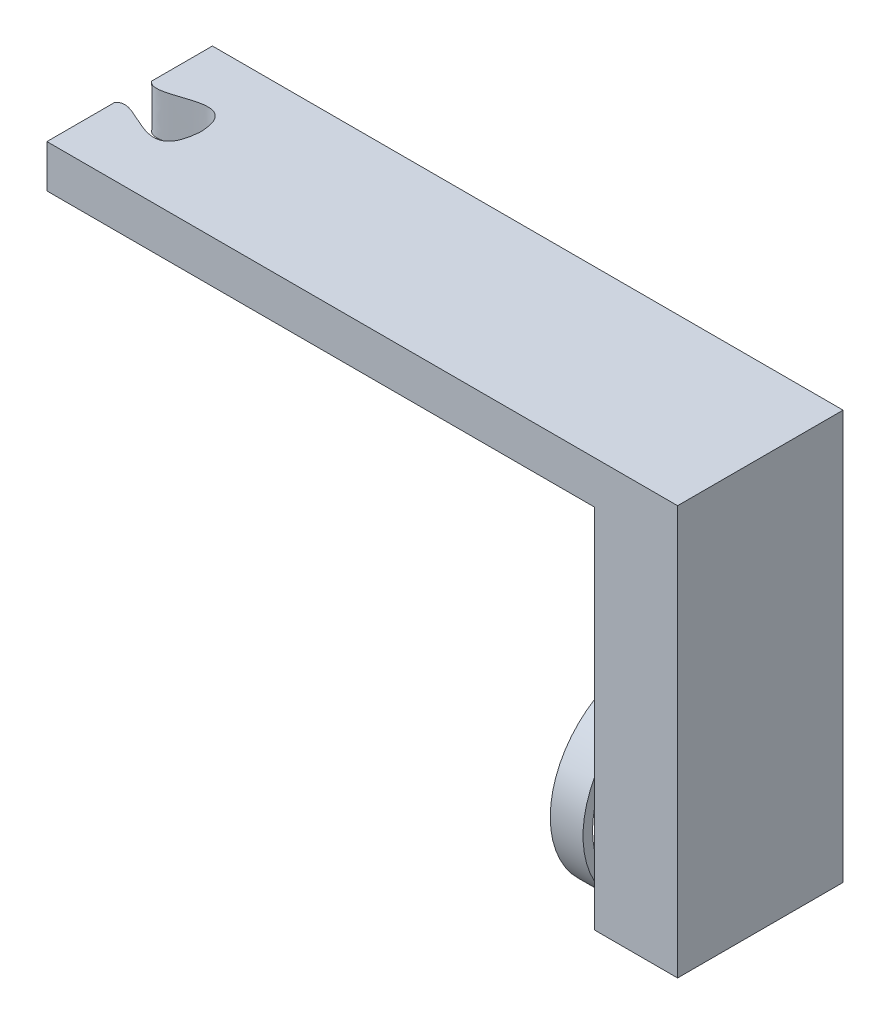
ISO-10303-21;
HEADER;
FILE_DESCRIPTION(('STEP AP214'),'2;1');
FILE_NAME('part.step','',(''),(''),'','','');
FILE_SCHEMA(('AUTOMOTIVE_DESIGN { 1 0 10303 214 1 1 1 1 }'));
ENDSEC;
DATA;
#1=APPLICATION_CONTEXT('core data for automotive mechanical design processes');
#2=APPLICATION_PROTOCOL_DEFINITION('international standard','automotive_design',2000,#1);
#3=PRODUCT_CONTEXT('',#1,'mechanical');
#4=PRODUCT('Part','Part','',(#3));
#5=PRODUCT_RELATED_PRODUCT_CATEGORY('part','',(#4));
#6=PRODUCT_DEFINITION_FORMATION('','',#4);
#7=PRODUCT_DEFINITION_CONTEXT('part definition',#1,'design');
#8=PRODUCT_DEFINITION('design','',#6,#7);
#9=PRODUCT_DEFINITION_SHAPE('','',#8);
#10=(LENGTH_UNIT() NAMED_UNIT(*) SI_UNIT(.MILLI.,.METRE.));
#11=(NAMED_UNIT(*) PLANE_ANGLE_UNIT() SI_UNIT($,.RADIAN.));
#12=(NAMED_UNIT(*) SI_UNIT($,.STERADIAN.) SOLID_ANGLE_UNIT());
#13=UNCERTAINTY_MEASURE_WITH_UNIT(LENGTH_MEASURE(1.E-05),#10,'distance_accuracy_value','');
#14=(GEOMETRIC_REPRESENTATION_CONTEXT(3) GLOBAL_UNCERTAINTY_ASSIGNED_CONTEXT((#13)) GLOBAL_UNIT_ASSIGNED_CONTEXT((#10,
#11,#12)) REPRESENTATION_CONTEXT('',''));
#15=CARTESIAN_POINT('',(0.,0.,0.));
#16=DIRECTION('',(0.,0.,1.));
#17=DIRECTION('',(1.,0.,0.));
#18=AXIS2_PLACEMENT_3D('',#15,#16,#17);
#19=CARTESIAN_POINT('',(127.99867768057,-85.6305179197235,-38.6949708390272));
#20=DIRECTION('',(1.,0.,0.));
#21=DIRECTION('',(0.,0.,-1.));
#22=AXIS2_PLACEMENT_3D('',#19,#20,#21);
#23=PLANE('',#22);
#24=CARTESIAN_POINT('',(127.99867768057,-65.278,-19.3474854195136));
#25=DIRECTION('',(-1.,0.,0.));
#26=DIRECTION('',(0.,0.,1.));
#27=AXIS2_PLACEMENT_3D('',#24,#25,#26);
#28=CIRCLE('',#27,22.);
#29=CARTESIAN_POINT('',(127.99867768057,-75.7505740838491,-38.6949708390272));
#30=VERTEX_POINT('',#29);
#31=CARTESIAN_POINT('',(127.99867768057,-85.6305179197235,-27.7006293981204));
#32=VERTEX_POINT('',#31);
#33=EDGE_CURVE('E179',#30,#32,#28,.T.);
#34=ORIENTED_EDGE('',*,*,#33,.F.);
#35=DIRECTION('',(0.,1.,0.));
#36=VECTOR('',#35,1.);
#37=CARTESIAN_POINT('',(127.99867768057,-85.6305179197235,-38.6949708390272));
#38=LINE('',#37,#36);
#39=CARTESIAN_POINT('',(127.99867768057,-85.6305179197235,-38.6949708390272));
#40=VERTEX_POINT('',#39);
#41=EDGE_CURVE('E185',#40,#30,#38,.T.);
#42=ORIENTED_EDGE('',*,*,#41,.F.);
#43=DIRECTION('',(0.,0.,-1.));
#44=VECTOR('',#43,1.);
#45=CARTESIAN_POINT('',(127.99867768057,-85.6305179197235,-38.6949708390272));
#46=LINE('',#45,#44);
#47=EDGE_CURVE('E322',#32,#40,#46,.T.);
#48=ORIENTED_EDGE('',*,*,#47,.F.);
#49=EDGE_LOOP('',(#34,#42,#48));
#50=FACE_BOUND('',#49,.T.);
#51=ADVANCED_FACE('F33',(#50),#23,.F.);
#52=CARTESIAN_POINT('',(127.99867768057,-69.3945278626384,-38.6949708390272));
#53=VERTEX_POINT('',#52);
#54=CARTESIAN_POINT('',(127.99867768057,-61.1614721373615,-38.6949708390272));
#55=VERTEX_POINT('',#54);
#56=EDGE_CURVE('E189',#53,#55,#38,.T.);
#57=ORIENTED_EDGE('',*,*,#56,.F.);
#58=CARTESIAN_POINT('',(127.99867768057,-65.278,-19.3474854195136));
#59=DIRECTION('',(-1.,0.,0.));
#60=DIRECTION('',(0.,0.,1.));
#61=AXIS2_PLACEMENT_3D('',#58,#59,#60);
#62=CIRCLE('',#61,19.7805711166834);
#63=CARTESIAN_POINT('',(127.99867768057,-69.3945278626384,0.));
#64=VERTEX_POINT('',#63);
#65=EDGE_CURVE('E528',#53,#64,#62,.T.);
#66=ORIENTED_EDGE('',*,*,#65,.T.);
#67=DIRECTION('',(0.,1.,0.));
#68=VECTOR('',#67,1.);
#69=CARTESIAN_POINT('',(127.99867768057,-85.6305179197235,0.));
#70=LINE('',#69,#68);
#71=CARTESIAN_POINT('',(127.99867768057,-61.1614721373615,0.));
#72=VERTEX_POINT('',#71);
#73=EDGE_CURVE('E184',#64,#72,#70,.T.);
#74=ORIENTED_EDGE('',*,*,#73,.T.);
#75=EDGE_CURVE('E334',#72,#55,#62,.T.);
#76=ORIENTED_EDGE('',*,*,#75,.T.);
#77=EDGE_LOOP('',(#57,#66,#74,#76));
#78=FACE_BOUND('',#77,.T.);
#79=ADVANCED_FACE('F290',(#78),#23,.F.);
#80=CARTESIAN_POINT('',(127.99867768057,-85.6305179197235,-10.9943414409068));
#81=VERTEX_POINT('',#80);
#82=CARTESIAN_POINT('',(127.99867768057,-75.7505740838491,0.));
#83=VERTEX_POINT('',#82);
#84=EDGE_CURVE('E169',#81,#83,#28,.T.);
#85=ORIENTED_EDGE('',*,*,#84,.F.);
#86=CARTESIAN_POINT('',(127.99867768057,-85.6305179197235,0.));
#87=VERTEX_POINT('',#86);
#88=EDGE_CURVE('E316',#87,#81,#46,.T.);
#89=ORIENTED_EDGE('',*,*,#88,.F.);
#90=EDGE_CURVE('E187',#87,#83,#70,.T.);
#91=ORIENTED_EDGE('',*,*,#90,.T.);
#92=EDGE_LOOP('',(#85,#89,#91));
#93=FACE_BOUND('',#92,.T.);
#94=ADVANCED_FACE('F296',(#93),#23,.F.);
#95=CARTESIAN_POINT('',(8.50286693849363,0.,-14.0278837687706));
#96=DIRECTION('',(0.,1.,0.));
#97=DIRECTION('',(0.,0.,1.));
#98=AXIS2_PLACEMENT_3D('',#95,#96,#97);
#99=PLANE('',#98);
#100=DIRECTION('',(0.,0.,-1.));
#101=VECTOR('',#100,1.);
#102=CARTESIAN_POINT('',(127.99867768057,0.,-38.6949708390272));
#103=LINE('',#102,#101);
#104=CARTESIAN_POINT('',(127.99867768057,0.,0.));
#105=VERTEX_POINT('',#104);
#106=CARTESIAN_POINT('',(127.99867768057,0.,-38.6949708390272));
#107=VERTEX_POINT('',#106);
#108=EDGE_CURVE('E329',#105,#107,#103,.T.);
#109=ORIENTED_EDGE('',*,*,#108,.F.);
#110=DIRECTION('',(1.,0.,0.));
#111=VECTOR('',#110,1.);
#112=CARTESIAN_POINT('',(0.,0.,0.));
#113=LINE('',#112,#111);
#114=CARTESIAN_POINT('',(0.,0.,0.));
#115=VERTEX_POINT('',#114);
#116=EDGE_CURVE('E183',#115,#105,#113,.T.);
#117=ORIENTED_EDGE('',*,*,#116,.F.);
#118=DIRECTION('',(0.,0.,1.));
#119=VECTOR('',#118,1.);
#120=CARTESIAN_POINT('',(0.,0.,0.));
#121=LINE('',#120,#119);
#122=CARTESIAN_POINT('',(0.,0.,-15.7402455204805));
#123=VERTEX_POINT('',#122);
#124=EDGE_CURVE('E193',#123,#115,#121,.T.);
#125=ORIENTED_EDGE('',*,*,#124,.F.);
#126=CARTESIAN_POINT('',(15.9956701151346,0.,-19.7112346821213));
#127=CARTESIAN_POINT('',(14.8015757870651,0.,-5.45231285430229));
#128=CARTESIAN_POINT('',(2.54084601053969,0.,-20.1382171282187));
#129=CARTESIAN_POINT('',(0.,0.,-15.7402455204805));
#130=B_SPLINE_CURVE_WITH_KNOTS('',3,(#126,#127,#128,#129),.UNSPECIFIED.,.F.,.F.,(4,4),(0.,1.),.UNSPECIFIED.);
#131=CARTESIAN_POINT('',(15.9956701151346,0.,-19.7112346821211));
#132=VERTEX_POINT('',#131);
#133=EDGE_CURVE('E219',#132,#123,#130,.T.);
#134=ORIENTED_EDGE('',*,*,#133,.F.);
#135=CARTESIAN_POINT('',(0.,0.,-24.5181517683483));
#136=CARTESIAN_POINT('',(3.02541148233719,0.,-20.2578397164155));
#137=CARTESIAN_POINT('',(15.7773313591399,0.,-32.7734693197357));
#138=CARTESIAN_POINT('',(15.9956701151346,0.,-19.7112346821211));
#139=B_SPLINE_CURVE_WITH_KNOTS('',3,(#135,#136,#137,#138),.UNSPECIFIED.,.F.,.F.,(4,4),(0.,1.),.UNSPECIFIED.);
#140=CARTESIAN_POINT('',(0.,0.,-24.5181517683483));
#141=VERTEX_POINT('',#140);
#142=EDGE_CURVE('E215',#141,#132,#139,.T.);
#143=ORIENTED_EDGE('',*,*,#142,.F.);
#144=DIRECTION('',(0.,0.,1.));
#145=VECTOR('',#144,1.);
#146=CARTESIAN_POINT('',(0.,0.,-24.5181517683483));
#147=LINE('',#146,#145);
#148=CARTESIAN_POINT('',(0.,0.,-38.6949708390272));
#149=VERTEX_POINT('',#148);
#150=EDGE_CURVE('E213',#149,#141,#147,.T.);
#151=ORIENTED_EDGE('',*,*,#150,.F.);
#152=DIRECTION('',(-1.,0.,0.));
#153=VECTOR('',#152,1.);
#154=CARTESIAN_POINT('',(0.,0.,-38.6949708390272));
#155=LINE('',#154,#153);
#156=EDGE_CURVE('E203',#107,#149,#155,.T.);
#157=ORIENTED_EDGE('',*,*,#156,.F.);
#158=EDGE_LOOP('',(#109,#117,#125,#134,#143,#151,#157));
#159=FACE_BOUND('',#158,.T.);
#160=ADVANCED_FACE('F279',(#159),#99,.F.);
#161=CARTESIAN_POINT('',(0.,10.,0.));
#162=DIRECTION('',(1.,0.,0.));
#163=DIRECTION('',(0.,0.,-1.));
#164=AXIS2_PLACEMENT_3D('',#161,#162,#163);
#165=PLANE('',#164);
#166=ORIENTED_EDGE('',*,*,#124,.T.);
#167=DIRECTION('',(0.,-1.,0.));
#168=VECTOR('',#167,1.);
#169=CARTESIAN_POINT('',(0.,10.,0.));
#170=LINE('',#169,#168);
#171=CARTESIAN_POINT('',(0.,10.,0.));
#172=VERTEX_POINT('',#171);
#173=EDGE_CURVE('E245',#172,#115,#170,.T.);
#174=ORIENTED_EDGE('',*,*,#173,.F.);
#175=DIRECTION('',(0.,0.,1.));
#176=VECTOR('',#175,1.);
#177=CARTESIAN_POINT('',(0.,10.,0.));
#178=LINE('',#177,#176);
#179=CARTESIAN_POINT('',(0.,10.,-15.7402455204805));
#180=VERTEX_POINT('',#179);
#181=EDGE_CURVE('E226',#180,#172,#178,.T.);
#182=ORIENTED_EDGE('',*,*,#181,.F.);
#183=DIRECTION('',(0.,-1.,0.));
#184=VECTOR('',#183,1.);
#185=CARTESIAN_POINT('',(0.,10.,-15.7402455204805));
#186=LINE('',#185,#184);
#187=EDGE_CURVE('E227',#180,#123,#186,.T.);
#188=ORIENTED_EDGE('',*,*,#187,.T.);
#189=EDGE_LOOP('',(#166,#174,#182,#188));
#190=FACE_BOUND('',#189,.T.);
#191=ADVANCED_FACE('F275',(#190),#165,.F.);
#192=CARTESIAN_POINT('',(0.,10.,0.));
#193=DIRECTION('',(0.,0.,-1.));
#194=DIRECTION('',(-1.,0.,0.));
#195=AXIS2_PLACEMENT_3D('',#192,#193,#194);
#196=PLANE('',#195);
#197=ORIENTED_EDGE('',*,*,#116,.T.);
#198=CARTESIAN_POINT('',(127.99867768057,-54.8054259161509,0.));
#199=VERTEX_POINT('',#198);
#200=EDGE_CURVE('E176',#199,#105,#70,.T.);
#201=ORIENTED_EDGE('',*,*,#200,.F.);
#202=DIRECTION('',(0.,1.,0.));
#203=VECTOR('',#202,1.);
#204=CARTESIAN_POINT('',(127.99867768057,10.,0.));
#205=LINE('',#204,#203);
#206=EDGE_CURVE('E145',#72,#199,#205,.T.);
#207=ORIENTED_EDGE('',*,*,#206,.F.);
#208=ORIENTED_EDGE('',*,*,#73,.F.);
#209=EDGE_CURVE('E157',#83,#64,#205,.T.);
#210=ORIENTED_EDGE('',*,*,#209,.F.);
#211=ORIENTED_EDGE('',*,*,#90,.F.);
#212=DIRECTION('',(-1.,0.,0.));
#213=VECTOR('',#212,1.);
#214=CARTESIAN_POINT('',(147.451699193348,-85.6305179197235,0.));
#215=LINE('',#214,#213);
#216=CARTESIAN_POINT('',(147.451699193348,-85.6305179197235,0.));
#217=VERTEX_POINT('',#216);
#218=EDGE_CURVE('E320',#217,#87,#215,.T.);
#219=ORIENTED_EDGE('',*,*,#218,.F.);
#220=DIRECTION('',(0.,-1.,0.));
#221=VECTOR('',#220,1.);
#222=CARTESIAN_POINT('',(147.451699193348,10.,0.));
#223=LINE('',#222,#221);
#224=CARTESIAN_POINT('',(147.451699193348,10.,0.));
#225=VERTEX_POINT('',#224);
#226=EDGE_CURVE('E243',#225,#217,#223,.T.);
#227=ORIENTED_EDGE('',*,*,#226,.F.);
#228=DIRECTION('',(1.,0.,0.));
#229=VECTOR('',#228,1.);
#230=CARTESIAN_POINT('',(0.,10.,0.));
#231=LINE('',#230,#229);
#232=EDGE_CURVE('E495',#172,#225,#231,.T.);
#233=ORIENTED_EDGE('',*,*,#232,.F.);
#234=ORIENTED_EDGE('',*,*,#173,.T.);
#235=EDGE_LOOP('',(#197,#201,#207,#208,#210,#211,#219,#227,#233,#234));
#236=FACE_BOUND('',#235,.T.);
#237=ADVANCED_FACE('F181',(#236),#196,.F.);
#238=CARTESIAN_POINT('',(147.451699193348,10.,0.));
#239=DIRECTION('',(-1.,0.,0.));
#240=DIRECTION('',(0.,0.,1.));
#241=AXIS2_PLACEMENT_3D('',#238,#239,#240);
#242=PLANE('',#241);
#243=ORIENTED_EDGE('',*,*,#226,.T.);
#244=DIRECTION('',(0.,0.,1.));
#245=VECTOR('',#244,1.);
#246=CARTESIAN_POINT('',(147.451699193348,-85.6305179197235,-38.6949708390272));
#247=LINE('',#246,#245);
#248=CARTESIAN_POINT('',(147.451699193348,-85.6305179197235,-38.6949708390272));
#249=VERTEX_POINT('',#248);
#250=EDGE_CURVE('E330',#249,#217,#247,.T.);
#251=ORIENTED_EDGE('',*,*,#250,.F.);
#252=DIRECTION('',(0.,-1.,0.));
#253=VECTOR('',#252,1.);
#254=CARTESIAN_POINT('',(147.451699193348,10.,-38.6949708390272));
#255=LINE('',#254,#253);
#256=CARTESIAN_POINT('',(147.451699193348,10.,-38.6949708390272));
#257=VERTEX_POINT('',#256);
#258=EDGE_CURVE('E241',#257,#249,#255,.T.);
#259=ORIENTED_EDGE('',*,*,#258,.F.);
#260=DIRECTION('',(0.,0.,-1.));
#261=VECTOR('',#260,1.);
#262=CARTESIAN_POINT('',(147.451699193348,10.,0.));
#263=LINE('',#262,#261);
#264=EDGE_CURVE('E493',#225,#257,#263,.T.);
#265=ORIENTED_EDGE('',*,*,#264,.F.);
#266=EDGE_LOOP('',(#243,#251,#259,#265));
#267=FACE_BOUND('',#266,.T.);
#268=ADVANCED_FACE('F281',(#267),#242,.F.);
#269=CARTESIAN_POINT('',(0.,10.,-38.6949708390272));
#270=DIRECTION('',(0.,0.,1.));
#271=DIRECTION('',(1.,0.,0.));
#272=AXIS2_PLACEMENT_3D('',#269,#270,#271);
#273=PLANE('',#272);
#274=ORIENTED_EDGE('',*,*,#258,.T.);
#275=DIRECTION('',(1.,0.,0.));
#276=VECTOR('',#275,1.);
#277=CARTESIAN_POINT('',(147.451699193348,-85.6305179197235,-38.6949708390272));
#278=LINE('',#277,#276);
#279=EDGE_CURVE('E321',#40,#249,#278,.T.);
#280=ORIENTED_EDGE('',*,*,#279,.F.);
#281=ORIENTED_EDGE('',*,*,#41,.T.);
#282=DIRECTION('',(1.,0.,0.));
#283=VECTOR('',#282,1.);
#284=CARTESIAN_POINT('',(125.514471600455,-75.7505740838491,-38.6949708390272));
#285=LINE('',#284,#283);
#286=CARTESIAN_POINT('',(125.514471600455,-75.7505740838491,-38.6949708390272));
#287=VERTEX_POINT('',#286);
#288=EDGE_CURVE('E252',#287,#30,#285,.T.);
#289=ORIENTED_EDGE('',*,*,#288,.F.);
#290=CARTESIAN_POINT('',(125.514471600455,-75.7505740838491,-38.6949708390272));
#291=CARTESIAN_POINT('',(125.550343179766,-75.7505821210912,-38.6949708390272));
#292=CARTESIAN_POINT('',(125.586194514271,-75.7489508154648,-38.6949708390272));
#293=CARTESIAN_POINT('',(125.657579261295,-75.7424958336332,-38.6949708390272));
#294=CARTESIAN_POINT('',(125.693112914958,-75.7376748325695,-38.6949708390272));
#295=CARTESIAN_POINT('',(125.798239085199,-75.7186740089597,-38.6949708390272));
#296=CARTESIAN_POINT('',(125.867050257932,-75.6999527172484,-38.6949708390272));
#297=CARTESIAN_POINT('',(126.000545051518,-75.6519777639803,-38.6949708390272));
#298=CARTESIAN_POINT('',(126.065240576717,-75.6227562723554,-38.6949708390272));
#299=CARTESIAN_POINT('',(126.190069532043,-75.5556174564837,-38.6949708390272));
#300=CARTESIAN_POINT('',(126.250191667053,-75.5176794771868,-38.6949708390272));
#301=CARTESIAN_POINT('',(126.405648885233,-75.4061220219954,-38.6949708390272));
#302=CARTESIAN_POINT('',(126.496344768541,-75.3260542206037,-38.6949708390272));
#303=CARTESIAN_POINT('',(126.664433223933,-75.1530259955559,-38.6949708390272));
#304=CARTESIAN_POINT('',(126.74178779873,-75.0600300669887,-38.6949708390272));
#305=CARTESIAN_POINT('',(126.876936262689,-74.8764257770505,-38.6949708390272));
#306=CARTESIAN_POINT('',(126.935948219164,-74.7866975642048,-38.6949708390272));
#307=CARTESIAN_POINT('',(127.046097158916,-74.6024839484492,-38.6949708390272));
#308=CARTESIAN_POINT('',(127.097227469756,-74.5079946036729,-38.6949708390272));
#309=CARTESIAN_POINT('',(127.192749949446,-74.3154873537156,-38.6949708390272));
#310=CARTESIAN_POINT('',(127.237129469307,-74.2174632402184,-38.6949708390272));
#311=CARTESIAN_POINT('',(127.319950496428,-74.0190033783987,-38.6949708390272));
#312=CARTESIAN_POINT('',(127.358394069807,-73.9185684833227,-38.6949708390272));
#313=CARTESIAN_POINT('',(127.445857805038,-73.6715229138174,-38.6949708390272));
#314=CARTESIAN_POINT('',(127.492140582711,-73.5239456004216,-38.6949708390272));
#315=CARTESIAN_POINT('',(127.575977533437,-73.2263033450071,-38.6949708390272));
#316=CARTESIAN_POINT('',(127.613527295826,-73.0762371867935,-38.6949708390272));
#317=CARTESIAN_POINT('',(127.681397840127,-72.774227635312,-38.6949708390272));
#318=CARTESIAN_POINT('',(127.711706100988,-72.6222814615747,-38.6949708390272));
#319=CARTESIAN_POINT('',(127.766208816605,-72.3172840305921,-38.6949708390272));
#320=CARTESIAN_POINT('',(127.790402136091,-72.1642325735622,-38.6949708390272));
#321=CARTESIAN_POINT('',(127.833731955292,-71.8568771104341,-38.6949708390272));
#322=CARTESIAN_POINT('',(127.852850401356,-71.7025705932884,-38.6949708390272));
#323=CARTESIAN_POINT('',(127.886755165842,-71.3934776108957,-38.6949708390272));
#324=CARTESIAN_POINT('',(127.901541099163,-71.2386911042191,-38.6949708390272));
#325=CARTESIAN_POINT('',(127.94048042492,-70.774190363292,-38.6949708390272));
#326=CARTESIAN_POINT('',(127.959255891732,-70.464024715916,-38.6949708390272));
#327=CARTESIAN_POINT('',(127.978896848602,-70.0269365223592,-38.6949708390272));
#328=CARTESIAN_POINT('',(127.983786752477,-69.9001578085944,-38.6949708390272));
#329=CARTESIAN_POINT('',(127.992189452981,-69.6471007768233,-38.6949708390272));
#330=CARTESIAN_POINT('',(127.995708088487,-69.5208226546736,-38.6949708390272));
#331=CARTESIAN_POINT('',(127.99867768057,-69.3945278626384,-38.6949708390272));
#332=B_SPLINE_CURVE_WITH_KNOTS('',3,(#290,#291,#292,#293,#294,#295,#296,#297,#298,#299,#300,
#301,#302,#303,#304,#305,#306,#307,#308,#309,#310,#311,#312,#313,#314,#315,#316,#317,#318,#319,
#320,#321,#322,#323,#324,#325,#326,#327,#328,#329,#330,#331),.UNSPECIFIED.,.F.,.F.,(4,2,2,2,2,2,
2,2,2,2,2,2,2,2,2,2,2,2,2,2,4),(0.,0.107539759478924,0.214989441387204,0.427837876602936,
0.640039682165784,0.852749615469104,1.21360778409951,1.57547732126188,1.89719191506152,
2.21917738741151,2.54175892479246,2.86422792717296,3.32786519060385,3.79173611078337,
4.25640338330964,4.72115686048065,5.18754216911337,5.65396892045116,6.58588496423729,
6.96650279524936,7.34548176579939),.UNSPECIFIED.);
#333=EDGE_CURVE('E254',#287,#53,#332,.T.);
#334=ORIENTED_EDGE('',*,*,#333,.T.);
#335=ORIENTED_EDGE('',*,*,#56,.T.);
#336=CARTESIAN_POINT('',(127.99867768057,-61.1614721373615,-38.6949708390272));
#337=CARTESIAN_POINT('',(127.994784242223,-60.9963942603247,-38.6949708390272));
#338=CARTESIAN_POINT('',(127.989972043001,-60.8313287817768,-38.6949708390272));
#339=CARTESIAN_POINT('',(127.977907357119,-60.5012468645078,-38.6949708390272));
#340=CARTESIAN_POINT('',(127.970654255822,-60.3362304486266,-38.6949708390272));
#341=CARTESIAN_POINT('',(127.953050795044,-60.0053096937162,-38.6949708390272));
#342=CARTESIAN_POINT('',(127.942681113039,-59.83940634916,-38.6949708390272));
#343=CARTESIAN_POINT('',(127.918138898446,-59.5078899428237,-38.6949708390272));
#344=CARTESIAN_POINT('',(127.903966694485,-59.342276857203,-38.6949708390272));
#345=CARTESIAN_POINT('',(127.870734902914,-59.008949631682,-38.6949708390272));
#346=CARTESIAN_POINT('',(127.851603215006,-58.8412425445629,-38.6949708390272));
#347=CARTESIAN_POINT('',(127.807544037811,-58.5065946215418,-38.6949708390272));
#348=CARTESIAN_POINT('',(127.782617153989,-58.3396537074492,-38.6949708390272));
#349=CARTESIAN_POINT('',(127.725813794375,-58.0073667482993,-38.6949708390272));
#350=CARTESIAN_POINT('',(127.693954596812,-57.8420177866946,-38.6949708390272));
#351=CARTESIAN_POINT('',(127.621777819913,-57.5131995975266,-38.6949708390272));
#352=CARTESIAN_POINT('',(127.581463804364,-57.3497296084845,-38.6949708390272));
#353=CARTESIAN_POINT('',(127.513914086679,-57.1091036535757,-38.6949708390272));
#354=CARTESIAN_POINT('',(127.490628567401,-57.0308327643551,-38.6949708390272));
#355=CARTESIAN_POINT('',(127.441353557257,-56.8751287183536,-38.6949708390272));
#356=CARTESIAN_POINT('',(127.415363631043,-56.797695698672,-38.6949708390272));
#357=CARTESIAN_POINT('',(127.360387913964,-56.6438829155317,-38.6949708390272));
#358=CARTESIAN_POINT('',(127.331401891995,-56.567503233838,-38.6949708390272));
#359=CARTESIAN_POINT('',(127.270105357589,-56.4161111063108,-38.6949708390272));
#360=CARTESIAN_POINT('',(127.237795040547,-56.3410985804242,-38.6949708390272));
#361=CARTESIAN_POINT('',(127.134738664125,-56.117345406634,-38.6949708390272));
#362=CARTESIAN_POINT('',(127.058279666107,-55.9710864849292,-38.6949708390272));
#363=CARTESIAN_POINT('',(126.929537174516,-55.7604883233332,-38.6949708390272));
#364=CARTESIAN_POINT('',(126.884321233287,-55.6918039106965,-38.6949708390272));
#365=CARTESIAN_POINT('',(126.788613217664,-55.5582361766995,-38.6949708390272));
#366=CARTESIAN_POINT('',(126.738124390657,-55.4933505537805,-38.6949708390272));
#367=CARTESIAN_POINT('',(126.625744664372,-55.3621119357628,-38.6949708390272));
#368=CARTESIAN_POINT('',(126.563214828715,-55.296298078105,-38.6949708390272));
#369=CARTESIAN_POINT('',(126.430232158016,-55.1729774547407,-38.6949708390272));
#370=CARTESIAN_POINT('',(126.359774083727,-55.1154762403258,-38.6949708390272));
#371=CARTESIAN_POINT('',(126.209696543248,-55.0112952924595,-38.6949708390272));
#372=CARTESIAN_POINT('',(126.129966814217,-54.9647711496019,-38.6949708390272));
#373=CARTESIAN_POINT('',(125.963191664493,-54.8878383271716,-38.6949708390272));
#374=CARTESIAN_POINT('',(125.876178660563,-54.8573622235135,-38.6949708390272));
#375=CARTESIAN_POINT('',(125.742389348036,-54.8264544983683,-38.6949708390272));
#376=CARTESIAN_POINT('',(125.697258017965,-54.8186197560533,-38.6949708390272));
#377=CARTESIAN_POINT('',(125.606257973093,-54.8080860706146,-38.6949708390272));
#378=CARTESIAN_POINT('',(125.560387374349,-54.8054034861666,-38.6949708390272));
#379=CARTESIAN_POINT('',(125.514471600455,-54.8054259161509,-38.6949708390272));
#380=B_SPLINE_CURVE_WITH_KNOTS('',3,(#336,#337,#338,#339,#340,#341,#342,#343,#344,#345,#346,
#347,#348,#349,#350,#351,#352,#353,#354,#355,#356,#357,#358,#359,#360,#361,#362,#363,#364,#365,
#366,#367,#368,#369,#370,#371,#372,#373,#374,#375,#376,#377,#378,#379),.UNSPECIFIED.,.F.,.F.,(4,
2,2,2,2,2,2,2,2,2,2,2,2,2,2,2,2,2,2,2,2,4),(0.,0.495382780445646,0.99089039558185,
1.48953581112629,1.9881381460261,2.49444087958747,3.00069073998675,3.50569297922194,
4.01048278153267,4.25542602627788,4.50040876239635,4.74541040934375,4.99039766392564,
5.48415918658049,5.73065738231621,5.97700465378125,6.24876510337122,6.52070620797612,
6.79629699439868,7.07072048696721,7.20787314847901,7.34546056969179),.UNSPECIFIED.);
#381=CARTESIAN_POINT('',(125.514471600455,-54.8054259161509,-38.6949708390272));
#382=VERTEX_POINT('',#381);
#383=EDGE_CURVE('E260',#55,#382,#380,.T.);
#384=ORIENTED_EDGE('',*,*,#383,.T.);
#385=DIRECTION('',(1.,0.,0.));
#386=VECTOR('',#385,1.);
#387=CARTESIAN_POINT('',(127.99867768057,-54.8054259161509,-38.6949708390272));
#388=LINE('',#387,#386);
#389=CARTESIAN_POINT('',(127.99867768057,-54.8054259161509,-38.6949708390272));
#390=VERTEX_POINT('',#389);
#391=EDGE_CURVE('E247',#390,#382,#388,.F.);
#392=ORIENTED_EDGE('',*,*,#391,.F.);
#393=EDGE_CURVE('E178',#390,#107,#38,.T.);
#394=ORIENTED_EDGE('',*,*,#393,.T.);
#395=ORIENTED_EDGE('',*,*,#156,.T.);
#396=DIRECTION('',(0.,-1.,0.));
#397=VECTOR('',#396,1.);
#398=CARTESIAN_POINT('',(0.,10.,-38.6949708390272));
#399=LINE('',#398,#397);
#400=CARTESIAN_POINT('',(0.,10.,-38.6949708390272));
#401=VERTEX_POINT('',#400);
#402=EDGE_CURVE('E238',#401,#149,#399,.T.);
#403=ORIENTED_EDGE('',*,*,#402,.F.);
#404=DIRECTION('',(-1.,0.,0.));
#405=VECTOR('',#404,1.);
#406=CARTESIAN_POINT('',(0.,10.,-38.6949708390272));
#407=LINE('',#406,#405);
#408=EDGE_CURVE('E491',#257,#401,#407,.T.);
#409=ORIENTED_EDGE('',*,*,#408,.F.);
#410=EDGE_LOOP('',(#274,#280,#281,#289,#334,#335,#384,#392,#394,#395,#403,#409));
#411=FACE_BOUND('',#410,.T.);
#412=ADVANCED_FACE('F265',(#411),#273,.F.);
#413=CARTESIAN_POINT('',(0.,10.,-24.5181517683483));
#414=DIRECTION('',(1.,0.,0.));
#415=DIRECTION('',(0.,0.,-1.));
#416=AXIS2_PLACEMENT_3D('',#413,#414,#415);
#417=PLANE('',#416);
#418=ORIENTED_EDGE('',*,*,#150,.T.);
#419=DIRECTION('',(0.,-1.,0.));
#420=VECTOR('',#419,1.);
#421=CARTESIAN_POINT('',(0.,10.,-24.5181517683483));
#422=LINE('',#421,#420);
#423=CARTESIAN_POINT('',(0.,10.,-24.5181517683483));
#424=VERTEX_POINT('',#423);
#425=EDGE_CURVE('E235',#424,#141,#422,.T.);
#426=ORIENTED_EDGE('',*,*,#425,.F.);
#427=DIRECTION('',(0.,0.,1.));
#428=VECTOR('',#427,1.);
#429=CARTESIAN_POINT('',(0.,10.,-24.5181517683483));
#430=LINE('',#429,#428);
#431=EDGE_CURVE('E486',#401,#424,#430,.T.);
#432=ORIENTED_EDGE('',*,*,#431,.F.);
#433=ORIENTED_EDGE('',*,*,#402,.T.);
#434=EDGE_LOOP('',(#418,#426,#432,#433));
#435=FACE_BOUND('',#434,.T.);
#436=ADVANCED_FACE('F287',(#435),#417,.F.);
#437=CARTESIAN_POINT('',(0.,10.,-24.5181517683483));
#438=CARTESIAN_POINT('',(3.02541148233719,10.,-20.2578397164155));
#439=CARTESIAN_POINT('',(15.7773313591399,10.,-32.7734693197357));
#440=CARTESIAN_POINT('',(15.9956701151346,10.,-19.7112346821211));
#441=B_SPLINE_CURVE_WITH_KNOTS('',3,(#437,#438,#439,#440),.UNSPECIFIED.,.F.,.F.,(4,4),(0.,1.),.UNSPECIFIED.);
#442=DIRECTION('',(0.,-1.,0.));
#443=VECTOR('',#442,1.);
#444=SURFACE_OF_LINEAR_EXTRUSION('',#441,#443);
#445=ORIENTED_EDGE('',*,*,#142,.T.);
#446=DIRECTION('',(0.,-1.,0.));
#447=VECTOR('',#446,1.);
#448=CARTESIAN_POINT('',(15.9956701151346,10.,-19.7112346821211));
#449=LINE('',#448,#447);
#450=CARTESIAN_POINT('',(15.9956701151346,10.,-19.7112346821211));
#451=VERTEX_POINT('',#450);
#452=EDGE_CURVE('E232',#451,#132,#449,.T.);
#453=ORIENTED_EDGE('',*,*,#452,.F.);
#454=EDGE_CURVE('E481',#424,#451,#441,.T.);
#455=ORIENTED_EDGE('',*,*,#454,.F.);
#456=ORIENTED_EDGE('',*,*,#425,.T.);
#457=EDGE_LOOP('',(#445,#453,#455,#456));
#458=FACE_BOUND('',#457,.T.);
#459=ADVANCED_FACE('F418',(#458),#444,.F.);
#460=CARTESIAN_POINT('',(15.9956701151346,10.,-19.7112346821213));
#461=CARTESIAN_POINT('',(14.8015757870651,10.,-5.45231285430229));
#462=CARTESIAN_POINT('',(2.54084601053969,10.,-20.1382171282187));
#463=CARTESIAN_POINT('',(0.,10.,-15.7402455204805));
#464=B_SPLINE_CURVE_WITH_KNOTS('',3,(#460,#461,#462,#463),.UNSPECIFIED.,.F.,.F.,(4,4),(0.,1.),.UNSPECIFIED.);
#465=DIRECTION('',(0.,-1.,0.));
#466=VECTOR('',#465,1.);
#467=SURFACE_OF_LINEAR_EXTRUSION('',#464,#466);
#468=ORIENTED_EDGE('',*,*,#133,.T.);
#469=ORIENTED_EDGE('',*,*,#187,.F.);
#470=EDGE_CURVE('E206',#451,#180,#464,.T.);
#471=ORIENTED_EDGE('',*,*,#470,.F.);
#472=ORIENTED_EDGE('',*,*,#452,.T.);
#473=EDGE_LOOP('',(#468,#469,#471,#472));
#474=FACE_BOUND('',#473,.T.);
#475=ADVANCED_FACE('F307',(#474),#467,.F.);
#476=CARTESIAN_POINT('',(8.50286693849363,10.,-14.0278837687706));
#477=DIRECTION('',(0.,1.,0.));
#478=DIRECTION('',(0.,0.,1.));
#479=AXIS2_PLACEMENT_3D('',#476,#477,#478);
#480=PLANE('',#479);
#481=ORIENTED_EDGE('',*,*,#181,.T.);
#482=ORIENTED_EDGE('',*,*,#232,.T.);
#483=ORIENTED_EDGE('',*,*,#264,.T.);
#484=ORIENTED_EDGE('',*,*,#408,.T.);
#485=ORIENTED_EDGE('',*,*,#431,.T.);
#486=ORIENTED_EDGE('',*,*,#454,.T.);
#487=ORIENTED_EDGE('',*,*,#470,.T.);
#488=EDGE_LOOP('',(#481,#482,#483,#484,#485,#486,#487));
#489=FACE_BOUND('',#488,.T.);
#490=ADVANCED_FACE('F302',(#489),#480,.T.);
#491=EDGE_CURVE('E166',#199,#390,#28,.T.);
#492=ORIENTED_EDGE('',*,*,#491,.F.);
#493=ORIENTED_EDGE('',*,*,#200,.T.);
#494=ORIENTED_EDGE('',*,*,#108,.T.);
#495=ORIENTED_EDGE('',*,*,#393,.F.);
#496=EDGE_LOOP('',(#492,#493,#494,#495));
#497=FACE_BOUND('',#496,.T.);
#498=ADVANCED_FACE('F174',(#497),#23,.F.);
#499=CARTESIAN_POINT('',(0.,-85.6305179197235,0.));
#500=DIRECTION('',(0.,-1.,0.));
#501=DIRECTION('',(0.,0.,-1.));
#502=AXIS2_PLACEMENT_3D('',#499,#500,#501);
#503=PLANE('',#502);
#504=ORIENTED_EDGE('',*,*,#250,.T.);
#505=ORIENTED_EDGE('',*,*,#218,.T.);
#506=ORIENTED_EDGE('',*,*,#88,.T.);
#507=DIRECTION('',(1.,0.,0.));
#508=VECTOR('',#507,1.);
#509=CARTESIAN_POINT('',(125.49867768057,-85.6305179197235,-10.9943414409068));
#510=LINE('',#509,#508);
#511=CARTESIAN_POINT('',(125.49867768057,-85.6305179197235,-10.9943414409068));
#512=VERTEX_POINT('',#511);
#513=EDGE_CURVE('E47',#512,#81,#510,.T.);
#514=ORIENTED_EDGE('',*,*,#513,.F.);
#515=CARTESIAN_POINT('',(125.49867768057,-85.6305179197235,-10.9943414409068));
#516=CARTESIAN_POINT('',(125.528133764804,-85.6305179197235,-10.9943328440634));
#517=CARTESIAN_POINT('',(125.557573220726,-85.6305179197235,-10.9957135576317));
#518=CARTESIAN_POINT('',(125.616169310658,-85.6305179197235,-11.0011677969768));
#519=CARTESIAN_POINT('',(125.645326224489,-85.6305179197235,-11.0052383052011));
#520=CARTESIAN_POINT('',(125.731394655838,-85.6305179197235,-11.0212300338205));
#521=CARTESIAN_POINT('',(125.787630539509,-85.6305179197235,-11.0369361130918));
#522=CARTESIAN_POINT('',(125.908954625726,-85.6305179197235,-11.08154237718));
#523=CARTESIAN_POINT('',(125.973232699008,-85.6305179197235,-11.1125990653464));
#524=CARTESIAN_POINT('',(126.096114703692,-85.6305179197235,-11.1847516193488));
#525=CARTESIAN_POINT('',(126.154689834525,-85.6305179197235,-11.2258950872985));
#526=CARTESIAN_POINT('',(126.297882065475,-85.6305179197235,-11.3411451973671));
#527=CARTESIAN_POINT('',(126.37813678232,-85.6305179197235,-11.4206129755414));
#528=CARTESIAN_POINT('',(126.526052211885,-85.6305179197235,-11.5903106361491));
#529=CARTESIAN_POINT('',(126.593689586838,-85.6305179197235,-11.6805599649568));
#530=CARTESIAN_POINT('',(126.718346424783,-85.6305179197235,-11.8672971659625));
#531=CARTESIAN_POINT('',(126.77542155717,-85.6305179197235,-11.9637484957311));
#532=CARTESIAN_POINT('',(126.881328112531,-85.6305179197235,-12.1611277946116));
#533=CARTESIAN_POINT('',(126.930150833312,-85.6305179197235,-12.2620603493601));
#534=CARTESIAN_POINT('',(127.02106470191,-85.6305179197235,-12.4671741484332));
#535=CARTESIAN_POINT('',(127.063138991609,-85.6305179197235,-12.5713627749127));
#536=CARTESIAN_POINT('',(127.141518106103,-85.6305179197235,-12.781787056742));
#537=CARTESIAN_POINT('',(127.177826642676,-85.6305179197235,-12.8880213453684));
#538=CARTESIAN_POINT('',(127.251685124704,-85.6305179197235,-13.1212313138679));
#539=CARTESIAN_POINT('',(127.288286781942,-85.6305179197235,-13.2485053321722));
#540=CARTESIAN_POINT('',(127.355892506094,-85.6305179197235,-13.5045443480994));
#541=CARTESIAN_POINT('',(127.386895219717,-85.6305179197235,-13.6333096982021));
#542=CARTESIAN_POINT('',(127.444210768238,-85.6305179197235,-13.8920046824212));
#543=CARTESIAN_POINT('',(127.470518926992,-85.6305179197235,-14.0219353435073));
#544=CARTESIAN_POINT('',(127.519119264845,-85.6305179197235,-14.2825505468289));
#545=CARTESIAN_POINT('',(127.541411034676,-85.6305179197235,-14.4132351644935));
#546=CARTESIAN_POINT('',(127.60331070933,-85.6305179197235,-14.8070497674144));
#547=CARTESIAN_POINT('',(127.637743006071,-85.6305179197235,-15.0709936589102));
#548=CARTESIAN_POINT('',(127.696438956902,-85.6305179197235,-15.6000090268091));
#549=CARTESIAN_POINT('',(127.720700464445,-85.6305179197235,-15.8650807293248));
#550=CARTESIAN_POINT('',(127.751417572448,-85.6305179197235,-16.26434767399));
#551=CARTESIAN_POINT('',(127.760740248257,-85.6305179197235,-16.3983315973764));
#552=CARTESIAN_POINT('',(127.777665086972,-85.6305179197235,-16.6663924173828));
#553=CARTESIAN_POINT('',(127.785267450078,-85.6305179197235,-16.8004693013612));
#554=CARTESIAN_POINT('',(127.805825751443,-85.6305179197235,-17.2028567347909));
#555=CARTESIAN_POINT('',(127.816529865608,-85.6305179197235,-17.4712827883785));
#556=CARTESIAN_POINT('',(127.833157880725,-85.6305179197235,-18.0076489776045));
#557=CARTESIAN_POINT('',(127.839092838662,-85.6305179197235,-18.2755887918547));
#558=CARTESIAN_POINT('',(127.846929494378,-85.6305179197235,-18.811514574124));
#559=CARTESIAN_POINT('',(127.8488313722,-85.6305179197235,-19.0795005395488));
#560=CARTESIAN_POINT('',(127.848827891629,-85.6305179197235,-19.5571964007881));
#561=CARTESIAN_POINT('',(127.847660493928,-85.6305179197235,-19.7669067173474));
#562=CARTESIAN_POINT('',(127.842900165508,-85.6305179197235,-20.186300014242));
#563=CARTESIAN_POINT('',(127.839307244582,-85.6305179197235,-20.3959829946841));
#564=CARTESIAN_POINT('',(127.829429668765,-85.6305179197235,-20.8154700763852));
#565=CARTESIAN_POINT('',(127.823142666909,-85.6305179197235,-21.0252741235935));
#566=CARTESIAN_POINT('',(127.807426760735,-85.6305179197235,-21.4447639452371));
#567=CARTESIAN_POINT('',(127.797997907302,-85.6305179197235,-21.6544497215328));
#568=CARTESIAN_POINT('',(127.775435101954,-85.6305179197235,-22.0720019836762));
#569=CARTESIAN_POINT('',(127.762330326833,-85.6305179197235,-22.2798700132763));
#570=CARTESIAN_POINT('',(127.731529068878,-85.6305179197235,-22.6952636452965));
#571=CARTESIAN_POINT('',(127.713832805285,-85.6305179197235,-22.9027892635905));
#572=CARTESIAN_POINT('',(127.672738460265,-85.6305179197235,-23.3171152936195));
#573=CARTESIAN_POINT('',(127.649344995087,-85.6305179197235,-23.5239161556738));
#574=CARTESIAN_POINT('',(127.595392242807,-85.6305179197235,-23.9365666633155));
#575=CARTESIAN_POINT('',(127.564834453661,-85.6305179197235,-24.1424164985866));
#576=CARTESIAN_POINT('',(127.512482606784,-85.6305179197235,-24.4481348343268));
#577=CARTESIAN_POINT('',(127.494149049209,-85.6305179197235,-24.5485961329317));
#578=CARTESIAN_POINT('',(127.454984498909,-85.6305179197235,-24.7490324903018));
#579=CARTESIAN_POINT('',(127.434153356997,-85.6305179197235,-24.8490075196492));
#580=CARTESIAN_POINT('',(127.367292775572,-85.6305179197235,-25.1486600076925));
#581=CARTESIAN_POINT('',(127.31699918768,-85.6305179197235,-25.3474387000205));
#582=CARTESIAN_POINT('',(127.225808152372,-85.6305179197235,-25.6579499526393));
#583=CARTESIAN_POINT('',(127.18985288063,-85.6305179197235,-25.7711365146538));
#584=CARTESIAN_POINT('',(127.111983994774,-85.6305179197235,-25.9954287198797));
#585=CARTESIAN_POINT('',(127.070072369359,-85.6305179197235,-26.1065350436822));
#586=CARTESIAN_POINT('',(126.979247643586,-85.6305179197235,-26.3253965980847));
#587=CARTESIAN_POINT('',(126.930361115688,-85.6305179197235,-26.4331627389109));
#588=CARTESIAN_POINT('',(126.823946140016,-85.6305179197235,-26.6442884845638));
#589=CARTESIAN_POINT('',(126.766427386186,-85.6305179197235,-26.747652867476));
#590=CARTESIAN_POINT('',(126.656001471759,-85.6305179197235,-26.9232994240255));
#591=CARTESIAN_POINT('',(126.605391328758,-85.6305179197235,-26.9970135619039));
#592=CARTESIAN_POINT('',(126.496815738064,-85.6305179197235,-27.1390930445112));
#593=CARTESIAN_POINT('',(126.438839307966,-85.6305179197235,-27.207450151224));
#594=CARTESIAN_POINT('',(126.313652062544,-85.6305179197235,-27.3368744857005));
#595=CARTESIAN_POINT('',(126.246339533609,-85.6305179197235,-27.3978452447235));
#596=CARTESIAN_POINT('',(126.102107013713,-85.6305179197235,-27.5071922609006));
#597=CARTESIAN_POINT('',(126.025219440124,-85.6305179197235,-27.5556093913324));
#598=CARTESIAN_POINT('',(125.891754526027,-85.6305179197235,-27.6199304148251));
#599=CARTESIAN_POINT('',(125.837801860978,-85.6305179197235,-27.6412660781396));
#600=CARTESIAN_POINT('',(125.727141972395,-85.6305179197235,-27.6746834283998));
#601=CARTESIAN_POINT('',(125.670442554316,-85.6305179197235,-27.6867898700203));
#602=CARTESIAN_POINT('',(125.594189759528,-85.6305179197235,-27.6960146099461));
#603=CARTESIAN_POINT('',(125.575128968948,-85.6305179197235,-27.6977426339712));
#604=CARTESIAN_POINT('',(125.53694080541,-85.6305179197235,-27.7000495576563));
#605=CARTESIAN_POINT('',(125.51781344254,-85.6305179197235,-27.7006286244103));
#606=CARTESIAN_POINT('',(125.49867768057,-85.6305179197235,-27.7006293981209));
#607=B_SPLINE_CURVE_WITH_KNOTS('',3,(#515,#516,#517,#518,#519,#520,#521,#522,#523,#524,#525,
#526,#527,#528,#529,#530,#531,#532,#533,#534,#535,#536,#537,#538,#539,#540,#541,#542,#543,#544,
#545,#546,#547,#548,#549,#550,#551,#552,#553,#554,#555,#556,#557,#558,#559,#560,#561,#562,#563,
#564,#565,#566,#567,#568,#569,#570,#571,#572,#573,#574,#575,#576,#577,#578,#579,#580,#581,#582,
#583,#584,#585,#586,#587,#588,#589,#590,#591,#592,#593,#594,#595,#596,#597,#598,#599,#600,#601,
#602,#603,#604,#605,#606),.UNSPECIFIED.,.F.,.F.,(4,2,2,2,2,2,2,2,2,2,2,2,2,2,2,2,2,2,2,2,2,2,2,
2,2,2,2,2,2,2,2,2,2,2,2,2,2,2,2,2,2,2,2,2,2,4),(0.,0.0883052685841665,0.176511639498766,
0.350777019394309,0.563770528344824,0.777789240191834,1.11471374904452,1.45225540420463,
1.78796392078192,2.12402426392513,2.46091145984012,2.79758089334023,3.1947181909079,
3.5919513502292,3.9895780025216,4.38724514988522,5.18547857056744,5.98388037395682,
6.38679445206513,6.78966161760401,7.5955200836227,8.399504783926,9.20345359230962,
9.83258197269678,10.4617078131767,11.0913828385357,11.7210476664253,12.3458496033633,
12.9706217117643,13.5948892630372,14.2190264053565,14.525357749246,14.8317074002637,
15.4463084488551,15.8024636301505,16.1585001769175,16.5132148487857,16.8675341180634,
17.1354325752674,17.4037352351855,17.675231874162,17.9458331221782,18.1192365738458,
18.2921732692033,18.3495636159439,18.4069456157464),.UNSPECIFIED.);
#608=CARTESIAN_POINT('',(125.49867768057,-85.6305179197235,-27.7006293981204));
#609=VERTEX_POINT('',#608);
#610=EDGE_CURVE('E11',#512,#609,#607,.T.);
#611=ORIENTED_EDGE('',*,*,#610,.T.);
#612=DIRECTION('',(1.,0.,0.));
#613=VECTOR('',#612,1.);
#614=CARTESIAN_POINT('',(127.99867768057,-85.6305179197235,-27.7006293981204));
#615=LINE('',#614,#613);
#616=EDGE_CURVE('E52',#32,#609,#615,.F.);
#617=ORIENTED_EDGE('',*,*,#616,.F.);
#618=ORIENTED_EDGE('',*,*,#47,.T.);
#619=ORIENTED_EDGE('',*,*,#279,.T.);
#620=EDGE_LOOP('',(#504,#505,#506,#514,#611,#617,#618,#619));
#621=FACE_BOUND('',#620,.T.);
#622=ADVANCED_FACE('F301',(#621),#503,.T.);
#623=CARTESIAN_POINT('',(127.99867768057,-65.278,-19.3474854195136));
#624=DIRECTION('',(-1.,0.,0.));
#625=DIRECTION('',(0.,0.,1.));
#626=AXIS2_PLACEMENT_3D('',#623,#624,#625);
#627=PLANE('',#626);
#628=EDGE_CURVE('E148',#83,#199,#28,.T.);
#629=ORIENTED_EDGE('',*,*,#628,.F.);
#630=ORIENTED_EDGE('',*,*,#209,.T.);
#631=EDGE_CURVE('E151',#64,#72,#62,.T.);
#632=ORIENTED_EDGE('',*,*,#631,.T.);
#633=ORIENTED_EDGE('',*,*,#206,.T.);
#634=EDGE_LOOP('',(#629,#630,#632,#633));
#635=FACE_BOUND('',#634,.T.);
#636=ADVANCED_FACE('F147',(#635),#627,.F.);
#637=CARTESIAN_POINT('',(120.338250035091,-65.278,-19.3474854195136));
#638=DIRECTION('',(-1.,0.,0.));
#639=DIRECTION('',(0.,0.,1.));
#640=AXIS2_PLACEMENT_3D('',#637,#638,#639);
#641=PLANE('',#640);
#642=CARTESIAN_POINT('',(120.338250035091,-65.278,-19.3474854195136));
#643=DIRECTION('',(-1.,0.,0.));
#644=DIRECTION('',(0.,0.,1.));
#645=AXIS2_PLACEMENT_3D('',#642,#643,#644);
#646=CIRCLE('',#645,22.);
#647=CARTESIAN_POINT('',(120.338250035091,-65.278,2.65251458048638));
#648=VERTEX_POINT('',#647);
#649=EDGE_CURVE('E158',#648,#648,#646,.T.);
#650=ORIENTED_EDGE('',*,*,#649,.T.);
#651=EDGE_LOOP('',(#650));
#652=FACE_BOUND('',#651,.T.);
#653=CARTESIAN_POINT('',(120.338250035091,-65.278,-19.3474854195136));
#654=DIRECTION('',(-1.,0.,0.));
#655=DIRECTION('',(0.,0.,1.));
#656=AXIS2_PLACEMENT_3D('',#653,#654,#655);
#657=CIRCLE('',#656,19.7805711166834);
#658=CARTESIAN_POINT('',(120.338250035091,-65.278,0.433085697169811));
#659=VERTEX_POINT('',#658);
#660=EDGE_CURVE('E171',#659,#659,#657,.T.);
#661=ORIENTED_EDGE('',*,*,#660,.F.);
#662=EDGE_LOOP('',(#661));
#663=FACE_BOUND('',#662,.T.);
#664=ADVANCED_FACE('F343',(#652,#663),#641,.T.);
#665=CARTESIAN_POINT('',(120.338250035091,-65.278,-19.3474854195136));
#666=DIRECTION('',(1.,0.,0.));
#667=DIRECTION('',(0.,0.,-1.));
#668=AXIS2_PLACEMENT_3D('',#665,#666,#667);
#669=CYLINDRICAL_SURFACE('',#668,22.);
#670=ORIENTED_EDGE('',*,*,#649,.F.);
#671=EDGE_LOOP('',(#670));
#672=FACE_BOUND('',#671,.T.);
#673=CARTESIAN_POINT('',(125.49867768057,-65.278,-19.3474854195136));
#674=DIRECTION('',(-1.,0.,0.));
#675=DIRECTION('',(0.,0.,1.));
#676=AXIS2_PLACEMENT_3D('',#673,#674,#675);
#677=CIRCLE('',#676,22.);
#678=EDGE_CURVE('E522',#609,#512,#677,.T.);
#679=ORIENTED_EDGE('',*,*,#678,.T.);
#680=ORIENTED_EDGE('',*,*,#513,.T.);
#681=ORIENTED_EDGE('',*,*,#84,.T.);
#682=ORIENTED_EDGE('',*,*,#628,.T.);
#683=ORIENTED_EDGE('',*,*,#491,.T.);
#684=ORIENTED_EDGE('',*,*,#391,.T.);
#685=CARTESIAN_POINT('',(125.514471600455,-65.278,-19.3474854195136));
#686=DIRECTION('',(1.,0.,0.));
#687=DIRECTION('',(0.,0.,-1.));
#688=AXIS2_PLACEMENT_3D('',#685,#686,#687);
#689=CIRCLE('',#688,22.);
#690=EDGE_CURVE('E249',#382,#287,#689,.F.);
#691=ORIENTED_EDGE('',*,*,#690,.T.);
#692=ORIENTED_EDGE('',*,*,#288,.T.);
#693=ORIENTED_EDGE('',*,*,#33,.T.);
#694=ORIENTED_EDGE('',*,*,#616,.T.);
#695=EDGE_LOOP('',(#679,#680,#681,#682,#683,#684,#691,#692,#693,#694));
#696=FACE_BOUND('',#695,.T.);
#697=ADVANCED_FACE('F164',(#672,#696),#669,.T.);
#698=CARTESIAN_POINT('',(120.338250035091,-65.278,-19.3474854195136));
#699=DIRECTION('',(1.,0.,0.));
#700=DIRECTION('',(0.,0.,-1.));
#701=AXIS2_PLACEMENT_3D('',#698,#699,#700);
#702=CYLINDRICAL_SURFACE('',#701,19.7805711166834);
#703=ORIENTED_EDGE('',*,*,#660,.T.);
#704=EDGE_LOOP('',(#703));
#705=FACE_BOUND('',#704,.T.);
#706=ORIENTED_EDGE('',*,*,#75,.F.);
#707=ORIENTED_EDGE('',*,*,#631,.F.);
#708=ORIENTED_EDGE('',*,*,#65,.F.);
#709=EDGE_CURVE('E337',#55,#53,#62,.T.);
#710=ORIENTED_EDGE('',*,*,#709,.F.);
#711=EDGE_LOOP('',(#706,#707,#708,#710));
#712=FACE_BOUND('',#711,.T.);
#713=ADVANCED_FACE('F273',(#705,#712),#702,.F.);
#714=CARTESIAN_POINT('',(125.514471600455,-65.278,-19.3474854195136));
#715=DIRECTION('',(1.,0.,0.));
#716=DIRECTION('',(0.,0.,-1.));
#717=AXIS2_PLACEMENT_3D('',#714,#715,#716);
#718=TOROIDAL_SURFACE('',#717,19.5,2.5);
#719=ORIENTED_EDGE('',*,*,#383,.F.);
#720=ORIENTED_EDGE('',*,*,#709,.T.);
#721=ORIENTED_EDGE('',*,*,#333,.F.);
#722=ORIENTED_EDGE('',*,*,#690,.F.);
#723=EDGE_LOOP('',(#719,#720,#721,#722));
#724=FACE_BOUND('',#723,.T.);
#725=ADVANCED_FACE('F269',(#724),#718,.T.);
#726=CARTESIAN_POINT('',(125.49867768057,-65.278,-19.3474854195136));
#727=DIRECTION('',(-1.,0.,0.));
#728=DIRECTION('',(0.,0.,1.));
#729=AXIS2_PLACEMENT_3D('',#726,#727,#728);
#730=TOROIDAL_SURFACE('',#729,19.5,2.5);
#731=ORIENTED_EDGE('',*,*,#678,.F.);
#732=ORIENTED_EDGE('',*,*,#610,.F.);
#733=EDGE_LOOP('',(#731,#732));
#734=FACE_BOUND('',#733,.T.);
#735=ADVANCED_FACE('F35',(#734),#730,.T.);
#736=CLOSED_SHELL('',(#51,#79,#94,#160,#191,#237,#268,#412,#436,#459,#475,#490,#498,#622,#636,
#664,#697,#713,#725,#735));
#737=MANIFOLD_SOLID_BREP('B2',#736);
#738=ADVANCED_BREP_SHAPE_REPRESENTATION('',(#18,#737),#14);
#739=SHAPE_DEFINITION_REPRESENTATION(#9,#738);
ENDSEC;
END-ISO-10303-21;
